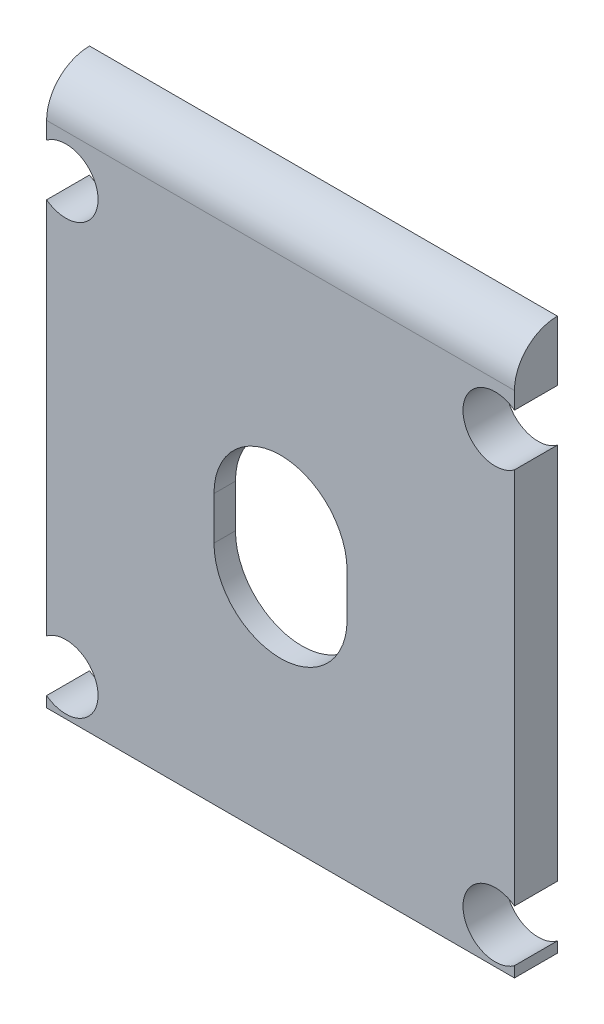
ISO-10303-21;
HEADER;
FILE_DESCRIPTION(('STEP AP214'),'2;1');
FILE_NAME('part.step','',(''),(''),'','','');
FILE_SCHEMA(('AUTOMOTIVE_DESIGN { 1 0 10303 214 1 1 1 1 }'));
ENDSEC;
DATA;
#1=APPLICATION_CONTEXT('core data for automotive mechanical design processes');
#2=APPLICATION_PROTOCOL_DEFINITION('international standard','automotive_design',2000,#1);
#3=PRODUCT_CONTEXT('',#1,'mechanical');
#4=PRODUCT('Part','Part','',(#3));
#5=PRODUCT_RELATED_PRODUCT_CATEGORY('part','',(#4));
#6=PRODUCT_DEFINITION_FORMATION('','',#4);
#7=PRODUCT_DEFINITION_CONTEXT('part definition',#1,'design');
#8=PRODUCT_DEFINITION('design','',#6,#7);
#9=PRODUCT_DEFINITION_SHAPE('','',#8);
#10=(LENGTH_UNIT() NAMED_UNIT(*) SI_UNIT(.MILLI.,.METRE.));
#11=(NAMED_UNIT(*) PLANE_ANGLE_UNIT() SI_UNIT($,.RADIAN.));
#12=(NAMED_UNIT(*) SI_UNIT($,.STERADIAN.) SOLID_ANGLE_UNIT());
#13=UNCERTAINTY_MEASURE_WITH_UNIT(LENGTH_MEASURE(1.E-05),#10,'distance_accuracy_value','');
#14=(GEOMETRIC_REPRESENTATION_CONTEXT(3) GLOBAL_UNCERTAINTY_ASSIGNED_CONTEXT((#13)) GLOBAL_UNIT_ASSIGNED_CONTEXT((#10,
#11,#12)) REPRESENTATION_CONTEXT('',''));
#15=CARTESIAN_POINT('',(0.,0.,0.));
#16=DIRECTION('',(0.,0.,1.));
#17=DIRECTION('',(1.,0.,0.));
#18=AXIS2_PLACEMENT_3D('',#15,#16,#17);
#19=CARTESIAN_POINT('',(50.,148.579145763423,51.9762421943497));
#20=DIRECTION('',(0.,0.,-1.));
#21=DIRECTION('',(-1.,0.,0.));
#22=AXIS2_PLACEMENT_3D('',#19,#20,#21);
#23=PLANE('',#22);
#24=DIRECTION('',(0.,-1.,0.));
#25=VECTOR('',#24,1.);
#26=CARTESIAN_POINT('',(45.1,198.42316898878,51.9762421943497));
#27=LINE('',#26,#25);
#28=CARTESIAN_POINT('',(45.1,200.42316898878,51.9762421943497));
#29=VERTEX_POINT('',#28);
#30=CARTESIAN_POINT('',(45.1,198.42316898878,51.9762421943497));
#31=VERTEX_POINT('',#30);
#32=EDGE_CURVE('E167',#29,#31,#27,.T.);
#33=ORIENTED_EDGE('',*,*,#32,.T.);
#34=CARTESIAN_POINT('',(42.,198.42316898878,51.9762421943497));
#35=DIRECTION('',(0.,0.,-1.));
#36=DIRECTION('',(-1.,0.,0.));
#37=AXIS2_PLACEMENT_3D('',#34,#35,#36);
#38=CIRCLE('',#37,3.1);
#39=CARTESIAN_POINT('',(38.9,198.42316898878,51.9762421943497));
#40=VERTEX_POINT('',#39);
#41=EDGE_CURVE('E158',#31,#40,#38,.T.);
#42=ORIENTED_EDGE('',*,*,#41,.T.);
#43=DIRECTION('',(0.,1.,0.));
#44=VECTOR('',#43,1.);
#45=CARTESIAN_POINT('',(38.9,198.42316898878,51.9762421943497));
#46=LINE('',#45,#44);
#47=CARTESIAN_POINT('',(38.9,200.42316898878,51.9762421943497));
#48=VERTEX_POINT('',#47);
#49=EDGE_CURVE('E170',#40,#48,#46,.T.);
#50=ORIENTED_EDGE('',*,*,#49,.T.);
#51=CARTESIAN_POINT('',(42.,200.42316898878,51.9762421943497));
#52=DIRECTION('',(0.,0.,-1.));
#53=DIRECTION('',(-1.,0.,0.));
#54=AXIS2_PLACEMENT_3D('',#51,#52,#53);
#55=CIRCLE('',#54,3.1);
#56=EDGE_CURVE('E63',#48,#29,#55,.T.);
#57=ORIENTED_EDGE('',*,*,#56,.T.);
#58=EDGE_LOOP('',(#33,#42,#50,#57));
#59=FACE_BOUND('',#58,.T.);
#60=DIRECTION('',(0.,1.,0.));
#61=VECTOR('',#60,1.);
#62=CARTESIAN_POINT('',(52.8963023340713,187.879145763423,51.9762421943497));
#63=LINE('',#62,#61);
#64=CARTESIAN_POINT('',(52.8963023340713,210.781910131842,51.9762421943497));
#65=VERTEX_POINT('',#64);
#66=CARTESIAN_POINT('',(52.8963023340713,211.579145763423,51.9762421943497));
#67=VERTEX_POINT('',#66);
#68=EDGE_CURVE('E249',#65,#67,#63,.T.);
#69=ORIENTED_EDGE('',*,*,#68,.T.);
#70=DIRECTION('',(-1.,0.,0.));
#71=VECTOR('',#70,1.);
#72=CARTESIAN_POINT('',(50.,211.579145763423,51.9762421943497));
#73=LINE('',#72,#71);
#74=CARTESIAN_POINT('',(31.1036976659287,211.579145763423,51.9762421943497));
#75=VERTEX_POINT('',#74);
#76=EDGE_CURVE('E318',#67,#75,#73,.T.);
#77=ORIENTED_EDGE('',*,*,#76,.T.);
#78=DIRECTION('',(0.,1.,0.));
#79=VECTOR('',#78,1.);
#80=CARTESIAN_POINT('',(31.1036976659287,187.879145763423,51.9762421943497));
#81=LINE('',#80,#79);
#82=CARTESIAN_POINT('',(31.1036976659287,210.781910131842,51.9762421943497));
#83=VERTEX_POINT('',#82);
#84=EDGE_CURVE('E228',#83,#75,#81,.T.);
#85=ORIENTED_EDGE('',*,*,#84,.F.);
#86=CARTESIAN_POINT('',(32.,209.579145763423,51.9762421943497));
#87=DIRECTION('',(0.,0.,1.));
#88=DIRECTION('',(1.,0.,0.));
#89=AXIS2_PLACEMENT_3D('',#86,#87,#88);
#90=CIRCLE('',#89,1.5);
#91=CARTESIAN_POINT('',(31.1036976659287,208.376381395004,51.9762421943497));
#92=VERTEX_POINT('',#91);
#93=EDGE_CURVE('E236',#92,#83,#90,.T.);
#94=ORIENTED_EDGE('',*,*,#93,.F.);
#95=CARTESIAN_POINT('',(31.1036976659287,190.781910131842,51.9762421943497));
#96=VERTEX_POINT('',#95);
#97=EDGE_CURVE('E254',#96,#92,#81,.T.);
#98=ORIENTED_EDGE('',*,*,#97,.F.);
#99=CARTESIAN_POINT('',(32.,189.579145763423,51.9762421943497));
#100=DIRECTION('',(0.,0.,1.));
#101=DIRECTION('',(1.,0.,0.));
#102=AXIS2_PLACEMENT_3D('',#99,#100,#101);
#103=CIRCLE('',#102,1.5);
#104=CARTESIAN_POINT('',(31.1036976659287,188.376381395004,51.9762421943497));
#105=VERTEX_POINT('',#104);
#106=EDGE_CURVE('E262',#105,#96,#103,.T.);
#107=ORIENTED_EDGE('',*,*,#106,.F.);
#108=CARTESIAN_POINT('',(31.1036976659287,187.879145763423,51.9762421943497));
#109=VERTEX_POINT('',#108);
#110=EDGE_CURVE('E250',#109,#105,#81,.T.);
#111=ORIENTED_EDGE('',*,*,#110,.F.);
#112=DIRECTION('',(1.,0.,0.));
#113=VECTOR('',#112,1.);
#114=CARTESIAN_POINT('',(31.1036976659287,187.879145763423,51.9762421943497));
#115=LINE('',#114,#113);
#116=CARTESIAN_POINT('',(52.8963023340713,187.879145763423,51.9762421943497));
#117=VERTEX_POINT('',#116);
#118=EDGE_CURVE('E216',#109,#117,#115,.T.);
#119=ORIENTED_EDGE('',*,*,#118,.T.);
#120=CARTESIAN_POINT('',(52.8963023340713,188.376381395004,51.9762421943497));
#121=VERTEX_POINT('',#120);
#122=EDGE_CURVE('E245',#117,#121,#63,.T.);
#123=ORIENTED_EDGE('',*,*,#122,.T.);
#124=CARTESIAN_POINT('',(52.,189.579145763423,51.9762421943497));
#125=DIRECTION('',(0.,0.,1.));
#126=DIRECTION('',(1.,0.,0.));
#127=AXIS2_PLACEMENT_3D('',#124,#125,#126);
#128=CIRCLE('',#127,1.5);
#129=CARTESIAN_POINT('',(52.8963023340713,190.781910131842,51.9762421943497));
#130=VERTEX_POINT('',#129);
#131=EDGE_CURVE('E294',#130,#121,#128,.T.);
#132=ORIENTED_EDGE('',*,*,#131,.F.);
#133=CARTESIAN_POINT('',(52.8963023340713,208.376381395004,51.9762421943497));
#134=VERTEX_POINT('',#133);
#135=EDGE_CURVE('E248',#130,#134,#63,.T.);
#136=ORIENTED_EDGE('',*,*,#135,.T.);
#137=CARTESIAN_POINT('',(52.,209.579145763423,51.9762421943497));
#138=DIRECTION('',(0.,0.,1.));
#139=DIRECTION('',(1.,0.,0.));
#140=AXIS2_PLACEMENT_3D('',#137,#138,#139);
#141=CIRCLE('',#140,1.5);
#142=EDGE_CURVE('E258',#65,#134,#141,.T.);
#143=ORIENTED_EDGE('',*,*,#142,.F.);
#144=EDGE_LOOP('',(#69,#77,#85,#94,#98,#107,#111,#119,#123,#132,#136,#143));
#145=FACE_BOUND('',#144,.T.);
#146=ADVANCED_FACE('F42',(#59,#145),#23,.F.);
#147=CARTESIAN_POINT('',(31.1036976659287,187.879145763423,49.9762421943497));
#148=DIRECTION('',(-1.,0.,0.));
#149=DIRECTION('',(0.,0.,1.));
#150=AXIS2_PLACEMENT_3D('',#147,#148,#149);
#151=PLANE('',#150);
#152=ORIENTED_EDGE('',*,*,#97,.T.);
#153=DIRECTION('',(0.,0.,-1.));
#154=VECTOR('',#153,1.);
#155=CARTESIAN_POINT('',(31.1036976659287,208.376381395004,384.));
#156=LINE('',#155,#154);
#157=CARTESIAN_POINT('',(31.1036976659287,208.376381395004,49.9762421943497));
#158=VERTEX_POINT('',#157);
#159=EDGE_CURVE('E310',#158,#92,#156,.F.);
#160=ORIENTED_EDGE('',*,*,#159,.F.);
#161=DIRECTION('',(0.,1.,0.));
#162=VECTOR('',#161,1.);
#163=CARTESIAN_POINT('',(31.1036976659287,187.879145763423,49.9762421943497));
#164=LINE('',#163,#162);
#165=CARTESIAN_POINT('',(31.1036976659287,190.781910131842,49.9762421943497));
#166=VERTEX_POINT('',#165);
#167=EDGE_CURVE('E237',#166,#158,#164,.T.);
#168=ORIENTED_EDGE('',*,*,#167,.F.);
#169=DIRECTION('',(0.,0.,-1.));
#170=VECTOR('',#169,1.);
#171=CARTESIAN_POINT('',(31.1036976659287,190.781910131842,384.));
#172=LINE('',#171,#170);
#173=EDGE_CURVE('E290',#96,#166,#172,.T.);
#174=ORIENTED_EDGE('',*,*,#173,.F.);
#175=EDGE_LOOP('',(#152,#160,#168,#174));
#176=FACE_BOUND('',#175,.T.);
#177=ADVANCED_FACE('F360',(#176),#151,.T.);
#178=ORIENTED_EDGE('',*,*,#84,.T.);
#179=CARTESIAN_POINT('',(31.1036976659287,211.579145763423,49.9762421943497));
#180=DIRECTION('',(-1.,0.,0.));
#181=DIRECTION('',(0.,0.,1.));
#182=AXIS2_PLACEMENT_3D('',#179,#180,#181);
#183=CIRCLE('',#182,2.);
#184=CARTESIAN_POINT('',(31.1036976659287,213.579145763423,49.9762421943497));
#185=VERTEX_POINT('',#184);
#186=EDGE_CURVE('E51',#75,#185,#183,.T.);
#187=ORIENTED_EDGE('',*,*,#186,.T.);
#188=CARTESIAN_POINT('',(31.1036976659287,210.781910131842,49.9762421943497));
#189=VERTEX_POINT('',#188);
#190=EDGE_CURVE('E238',#189,#185,#164,.T.);
#191=ORIENTED_EDGE('',*,*,#190,.F.);
#192=DIRECTION('',(0.,0.,-1.));
#193=VECTOR('',#192,1.);
#194=CARTESIAN_POINT('',(31.1036976659287,210.781910131842,384.));
#195=LINE('',#194,#193);
#196=EDGE_CURVE('E314',#83,#189,#195,.T.);
#197=ORIENTED_EDGE('',*,*,#196,.F.);
#198=EDGE_LOOP('',(#178,#187,#191,#197));
#199=FACE_BOUND('',#198,.T.);
#200=ADVANCED_FACE('F326',(#199),#151,.T.);
#201=CARTESIAN_POINT('',(52.8963023340713,187.879145763423,49.9762421943497));
#202=DIRECTION('',(1.,0.,0.));
#203=DIRECTION('',(0.,0.,-1.));
#204=AXIS2_PLACEMENT_3D('',#201,#202,#203);
#205=PLANE('',#204);
#206=ORIENTED_EDGE('',*,*,#135,.F.);
#207=DIRECTION('',(0.,0.,-1.));
#208=VECTOR('',#207,1.);
#209=CARTESIAN_POINT('',(52.8963023340713,190.781910131842,384.));
#210=LINE('',#209,#208);
#211=CARTESIAN_POINT('',(52.8963023340713,190.781910131842,49.9762421943497));
#212=VERTEX_POINT('',#211);
#213=EDGE_CURVE('E298',#212,#130,#210,.F.);
#214=ORIENTED_EDGE('',*,*,#213,.F.);
#215=DIRECTION('',(0.,1.,0.));
#216=VECTOR('',#215,1.);
#217=CARTESIAN_POINT('',(52.8963023340713,187.879145763423,49.9762421943497));
#218=LINE('',#217,#216);
#219=CARTESIAN_POINT('',(52.8963023340713,208.376381395004,49.9762421943497));
#220=VERTEX_POINT('',#219);
#221=EDGE_CURVE('E243',#212,#220,#218,.T.);
#222=ORIENTED_EDGE('',*,*,#221,.T.);
#223=DIRECTION('',(0.,0.,-1.));
#224=VECTOR('',#223,1.);
#225=CARTESIAN_POINT('',(52.8963023340713,208.376381395004,384.));
#226=LINE('',#225,#224);
#227=EDGE_CURVE('E270',#134,#220,#226,.T.);
#228=ORIENTED_EDGE('',*,*,#227,.F.);
#229=EDGE_LOOP('',(#206,#214,#222,#228));
#230=FACE_BOUND('',#229,.T.);
#231=ADVANCED_FACE('F347',(#230),#205,.T.);
#232=ORIENTED_EDGE('',*,*,#122,.F.);
#233=DIRECTION('',(0.,0.,-1.));
#234=VECTOR('',#233,1.);
#235=CARTESIAN_POINT('',(52.8963023340713,187.879145763423,49.9762421943497));
#236=LINE('',#235,#234);
#237=CARTESIAN_POINT('',(52.8963023340713,187.879145763423,49.9762421943497));
#238=VERTEX_POINT('',#237);
#239=EDGE_CURVE('E220',#117,#238,#236,.T.);
#240=ORIENTED_EDGE('',*,*,#239,.T.);
#241=CARTESIAN_POINT('',(52.8963023340713,188.376381395004,49.9762421943497));
#242=VERTEX_POINT('',#241);
#243=EDGE_CURVE('E239',#238,#242,#218,.T.);
#244=ORIENTED_EDGE('',*,*,#243,.T.);
#245=DIRECTION('',(0.,0.,-1.));
#246=VECTOR('',#245,1.);
#247=CARTESIAN_POINT('',(52.8963023340713,188.376381395004,384.));
#248=LINE('',#247,#246);
#249=EDGE_CURVE('E302',#121,#242,#248,.T.);
#250=ORIENTED_EDGE('',*,*,#249,.F.);
#251=EDGE_LOOP('',(#232,#240,#244,#250));
#252=FACE_BOUND('',#251,.T.);
#253=ADVANCED_FACE('F375',(#252),#205,.T.);
#254=CARTESIAN_POINT('',(31.1036976659287,187.879145763423,49.9762421943497));
#255=VERTEX_POINT('',#254);
#256=CARTESIAN_POINT('',(31.1036976659287,188.376381395004,49.9762421943497));
#257=VERTEX_POINT('',#256);
#258=EDGE_CURVE('E232',#255,#257,#164,.T.);
#259=ORIENTED_EDGE('',*,*,#258,.F.);
#260=DIRECTION('',(0.,0.,1.));
#261=VECTOR('',#260,1.);
#262=CARTESIAN_POINT('',(31.1036976659287,187.879145763423,49.9762421943497));
#263=LINE('',#262,#261);
#264=EDGE_CURVE('E212',#255,#109,#263,.T.);
#265=ORIENTED_EDGE('',*,*,#264,.T.);
#266=ORIENTED_EDGE('',*,*,#110,.T.);
#267=DIRECTION('',(0.,0.,-1.));
#268=VECTOR('',#267,1.);
#269=CARTESIAN_POINT('',(31.1036976659287,188.376381395004,384.));
#270=LINE('',#269,#268);
#271=EDGE_CURVE('E286',#257,#105,#270,.F.);
#272=ORIENTED_EDGE('',*,*,#271,.F.);
#273=EDGE_LOOP('',(#259,#265,#266,#272));
#274=FACE_BOUND('',#273,.T.);
#275=ADVANCED_FACE('F368',(#274),#151,.T.);
#276=CARTESIAN_POINT('',(31.1036976659287,187.879145763423,49.9762421943497));
#277=DIRECTION('',(0.,0.,-1.));
#278=DIRECTION('',(-1.,0.,0.));
#279=AXIS2_PLACEMENT_3D('',#276,#277,#278);
#280=PLANE('',#279);
#281=CARTESIAN_POINT('',(42.,199.42316898878,49.9762421943497));
#282=DIRECTION('',(0.,0.,-1.));
#283=DIRECTION('',(-1.,0.,0.));
#284=AXIS2_PLACEMENT_3D('',#281,#282,#283);
#285=CIRCLE('',#284,7.34999999999999);
#286=CARTESIAN_POINT('',(34.65,199.42316898878,49.9762421943497));
#287=VERTEX_POINT('',#286);
#288=EDGE_CURVE('E198',#287,#287,#285,.T.);
#289=ORIENTED_EDGE('',*,*,#288,.F.);
#290=EDGE_LOOP('',(#289));
#291=FACE_BOUND('',#290,.T.);
#292=ORIENTED_EDGE('',*,*,#167,.T.);
#293=CARTESIAN_POINT('',(32.,209.579145763423,49.9762421943497));
#294=DIRECTION('',(0.,0.,-1.));
#295=DIRECTION('',(-1.,0.,0.));
#296=AXIS2_PLACEMENT_3D('',#293,#294,#295);
#297=CIRCLE('',#296,1.5);
#298=EDGE_CURVE('E274',#189,#158,#297,.T.);
#299=ORIENTED_EDGE('',*,*,#298,.F.);
#300=ORIENTED_EDGE('',*,*,#190,.T.);
#301=DIRECTION('',(-1.,0.,0.));
#302=VECTOR('',#301,1.);
#303=CARTESIAN_POINT('',(31.1036976659287,213.579145763423,49.9762421943497));
#304=LINE('',#303,#302);
#305=CARTESIAN_POINT('',(52.8963023340713,213.579145763423,49.9762421943497));
#306=VERTEX_POINT('',#305);
#307=EDGE_CURVE('E208',#306,#185,#304,.T.);
#308=ORIENTED_EDGE('',*,*,#307,.F.);
#309=CARTESIAN_POINT('',(52.8963023340713,210.781910131842,49.9762421943497));
#310=VERTEX_POINT('',#309);
#311=EDGE_CURVE('E244',#310,#306,#218,.T.);
#312=ORIENTED_EDGE('',*,*,#311,.F.);
#313=CARTESIAN_POINT('',(52.,209.579145763423,49.9762421943497));
#314=DIRECTION('',(0.,0.,-1.));
#315=DIRECTION('',(-1.,0.,0.));
#316=AXIS2_PLACEMENT_3D('',#313,#314,#315);
#317=CIRCLE('',#316,1.5);
#318=EDGE_CURVE('E278',#220,#310,#317,.T.);
#319=ORIENTED_EDGE('',*,*,#318,.F.);
#320=ORIENTED_EDGE('',*,*,#221,.F.);
#321=CARTESIAN_POINT('',(52.,189.579145763423,49.9762421943497));
#322=DIRECTION('',(0.,0.,-1.));
#323=DIRECTION('',(-1.,0.,0.));
#324=AXIS2_PLACEMENT_3D('',#321,#322,#323);
#325=CIRCLE('',#324,1.5);
#326=EDGE_CURVE('E306',#242,#212,#325,.T.);
#327=ORIENTED_EDGE('',*,*,#326,.F.);
#328=ORIENTED_EDGE('',*,*,#243,.F.);
#329=DIRECTION('',(-1.,0.,0.));
#330=VECTOR('',#329,1.);
#331=CARTESIAN_POINT('',(31.1036976659287,187.879145763423,49.9762421943497));
#332=LINE('',#331,#330);
#333=EDGE_CURVE('E224',#238,#255,#332,.T.);
#334=ORIENTED_EDGE('',*,*,#333,.T.);
#335=ORIENTED_EDGE('',*,*,#258,.T.);
#336=CARTESIAN_POINT('',(32.,189.579145763423,49.9762421943497));
#337=DIRECTION('',(0.,0.,-1.));
#338=DIRECTION('',(-1.,0.,0.));
#339=AXIS2_PLACEMENT_3D('',#336,#337,#338);
#340=CIRCLE('',#339,1.5);
#341=EDGE_CURVE('E282',#166,#257,#340,.T.);
#342=ORIENTED_EDGE('',*,*,#341,.F.);
#343=EDGE_LOOP('',(#292,#299,#300,#308,#312,#319,#320,#327,#328,#334,#335,#342));
#344=FACE_BOUND('',#343,.T.);
#345=ADVANCED_FACE('F333',(#291,#344),#280,.T.);
#346=ORIENTED_EDGE('',*,*,#311,.T.);
#347=CARTESIAN_POINT('',(52.8963023340713,211.579145763423,49.9762421943497));
#348=DIRECTION('',(1.,0.,0.));
#349=DIRECTION('',(0.,0.,-1.));
#350=AXIS2_PLACEMENT_3D('',#347,#348,#349);
#351=CIRCLE('',#350,2.);
#352=EDGE_CURVE('E12',#306,#67,#351,.T.);
#353=ORIENTED_EDGE('',*,*,#352,.T.);
#354=ORIENTED_EDGE('',*,*,#68,.F.);
#355=DIRECTION('',(0.,0.,-1.));
#356=VECTOR('',#355,1.);
#357=CARTESIAN_POINT('',(52.8963023340713,210.781910131842,384.));
#358=LINE('',#357,#356);
#359=EDGE_CURVE('E266',#310,#65,#358,.F.);
#360=ORIENTED_EDGE('',*,*,#359,.F.);
#361=EDGE_LOOP('',(#346,#353,#354,#360));
#362=FACE_BOUND('',#361,.T.);
#363=ADVANCED_FACE('F340',(#362),#205,.T.);
#364=CARTESIAN_POINT('',(32.,209.579145763423,384.));
#365=DIRECTION('',(0.,0.,-1.));
#366=DIRECTION('',(-1.,0.,0.));
#367=AXIS2_PLACEMENT_3D('',#364,#365,#366);
#368=CYLINDRICAL_SURFACE('',#367,1.5);
#369=ORIENTED_EDGE('',*,*,#196,.T.);
#370=ORIENTED_EDGE('',*,*,#298,.T.);
#371=ORIENTED_EDGE('',*,*,#159,.T.);
#372=ORIENTED_EDGE('',*,*,#93,.T.);
#373=EDGE_LOOP('',(#369,#370,#371,#372));
#374=FACE_BOUND('',#373,.T.);
#375=ADVANCED_FACE('F358',(#374),#368,.F.);
#376=CARTESIAN_POINT('',(52.,209.579145763423,384.));
#377=DIRECTION('',(0.,0.,-1.));
#378=DIRECTION('',(-1.,0.,0.));
#379=AXIS2_PLACEMENT_3D('',#376,#377,#378);
#380=CYLINDRICAL_SURFACE('',#379,1.5);
#381=ORIENTED_EDGE('',*,*,#227,.T.);
#382=ORIENTED_EDGE('',*,*,#318,.T.);
#383=ORIENTED_EDGE('',*,*,#359,.T.);
#384=ORIENTED_EDGE('',*,*,#142,.T.);
#385=EDGE_LOOP('',(#381,#382,#383,#384));
#386=FACE_BOUND('',#385,.T.);
#387=ADVANCED_FACE('F350',(#386),#380,.F.);
#388=CARTESIAN_POINT('',(32.,189.579145763423,384.));
#389=DIRECTION('',(0.,0.,-1.));
#390=DIRECTION('',(-1.,0.,0.));
#391=AXIS2_PLACEMENT_3D('',#388,#389,#390);
#392=CYLINDRICAL_SURFACE('',#391,1.5);
#393=ORIENTED_EDGE('',*,*,#173,.T.);
#394=ORIENTED_EDGE('',*,*,#341,.T.);
#395=ORIENTED_EDGE('',*,*,#271,.T.);
#396=ORIENTED_EDGE('',*,*,#106,.T.);
#397=EDGE_LOOP('',(#393,#394,#395,#396));
#398=FACE_BOUND('',#397,.T.);
#399=ADVANCED_FACE('F364',(#398),#392,.F.);
#400=CARTESIAN_POINT('',(52.,189.579145763423,384.));
#401=DIRECTION('',(0.,0.,-1.));
#402=DIRECTION('',(-1.,0.,0.));
#403=AXIS2_PLACEMENT_3D('',#400,#401,#402);
#404=CYLINDRICAL_SURFACE('',#403,1.5);
#405=ORIENTED_EDGE('',*,*,#249,.T.);
#406=ORIENTED_EDGE('',*,*,#326,.T.);
#407=ORIENTED_EDGE('',*,*,#213,.T.);
#408=ORIENTED_EDGE('',*,*,#131,.T.);
#409=EDGE_LOOP('',(#405,#406,#407,#408));
#410=FACE_BOUND('',#409,.T.);
#411=ADVANCED_FACE('F377',(#410),#404,.F.);
#412=CARTESIAN_POINT('',(56.,187.879145763423,122.));
#413=DIRECTION('',(0.,1.,0.));
#414=DIRECTION('',(0.,0.,1.));
#415=AXIS2_PLACEMENT_3D('',#412,#413,#414);
#416=PLANE('',#415);
#417=ORIENTED_EDGE('',*,*,#264,.F.);
#418=ORIENTED_EDGE('',*,*,#333,.F.);
#419=ORIENTED_EDGE('',*,*,#239,.F.);
#420=ORIENTED_EDGE('',*,*,#118,.F.);
#421=EDGE_LOOP('',(#417,#418,#419,#420));
#422=FACE_BOUND('',#421,.T.);
#423=ADVANCED_FACE('F370',(#422),#416,.F.);
#424=CARTESIAN_POINT('',(50.,211.579145763423,49.9762421943497));
#425=DIRECTION('',(-1.,0.,0.));
#426=DIRECTION('',(0.,0.,1.));
#427=AXIS2_PLACEMENT_3D('',#424,#425,#426);
#428=CYLINDRICAL_SURFACE('',#427,2.);
#429=ORIENTED_EDGE('',*,*,#352,.F.);
#430=ORIENTED_EDGE('',*,*,#307,.T.);
#431=ORIENTED_EDGE('',*,*,#186,.F.);
#432=ORIENTED_EDGE('',*,*,#76,.F.);
#433=EDGE_LOOP('',(#429,#430,#431,#432));
#434=FACE_BOUND('',#433,.T.);
#435=ADVANCED_FACE('F44',(#434),#428,.T.);
#436=CARTESIAN_POINT('',(42.,199.42316898878,50.9762421943497));
#437=DIRECTION('',(0.,0.,-1.));
#438=DIRECTION('',(-1.,0.,0.));
#439=AXIS2_PLACEMENT_3D('',#436,#437,#438);
#440=CYLINDRICAL_SURFACE('',#439,7.34999999999999);
#441=CARTESIAN_POINT('',(42.,199.42316898878,50.9762421943497));
#442=DIRECTION('',(0.,0.,-1.));
#443=DIRECTION('',(-1.,0.,0.));
#444=AXIS2_PLACEMENT_3D('',#441,#442,#443);
#445=CIRCLE('',#444,7.34999999999999);
#446=CARTESIAN_POINT('',(34.65,199.42316898878,50.9762421943497));
#447=VERTEX_POINT('',#446);
#448=EDGE_CURVE('E204',#447,#447,#445,.T.);
#449=ORIENTED_EDGE('',*,*,#448,.F.);
#450=EDGE_LOOP('',(#449));
#451=FACE_BOUND('',#450,.T.);
#452=ORIENTED_EDGE('',*,*,#288,.T.);
#453=EDGE_LOOP('',(#452));
#454=FACE_BOUND('',#453,.T.);
#455=ADVANCED_FACE('F469',(#451,#454),#440,.F.);
#456=CARTESIAN_POINT('',(42.,199.42316898878,50.9762421943497));
#457=DIRECTION('',(0.,0.,-1.));
#458=DIRECTION('',(-1.,0.,0.));
#459=AXIS2_PLACEMENT_3D('',#456,#457,#458);
#460=PLANE('',#459);
#461=CARTESIAN_POINT('',(42.,198.42316898878,50.9762421943497));
#462=DIRECTION('',(0.,0.,-1.));
#463=DIRECTION('',(-1.,0.,0.));
#464=AXIS2_PLACEMENT_3D('',#461,#462,#463);
#465=CIRCLE('',#464,3.1);
#466=CARTESIAN_POINT('',(45.1,198.42316898878,50.9762421943497));
#467=VERTEX_POINT('',#466);
#468=CARTESIAN_POINT('',(38.9,198.42316898878,50.9762421943497));
#469=VERTEX_POINT('',#468);
#470=EDGE_CURVE('E161',#467,#469,#465,.T.);
#471=ORIENTED_EDGE('',*,*,#470,.F.);
#472=DIRECTION('',(0.,-1.,0.));
#473=VECTOR('',#472,1.);
#474=CARTESIAN_POINT('',(45.1,198.42316898878,50.9762421943497));
#475=LINE('',#474,#473);
#476=CARTESIAN_POINT('',(45.1,200.42316898878,50.9762421943497));
#477=VERTEX_POINT('',#476);
#478=EDGE_CURVE('E178',#477,#467,#475,.T.);
#479=ORIENTED_EDGE('',*,*,#478,.F.);
#480=CARTESIAN_POINT('',(42.,200.42316898878,50.9762421943497));
#481=DIRECTION('',(0.,0.,-1.));
#482=DIRECTION('',(-1.,0.,0.));
#483=AXIS2_PLACEMENT_3D('',#480,#481,#482);
#484=CIRCLE('',#483,3.1);
#485=CARTESIAN_POINT('',(38.9,200.42316898878,50.9762421943497));
#486=VERTEX_POINT('',#485);
#487=EDGE_CURVE('E58',#486,#477,#484,.T.);
#488=ORIENTED_EDGE('',*,*,#487,.F.);
#489=DIRECTION('',(0.,1.,0.));
#490=VECTOR('',#489,1.);
#491=CARTESIAN_POINT('',(38.9,198.42316898878,50.9762421943497));
#492=LINE('',#491,#490);
#493=EDGE_CURVE('E190',#469,#486,#492,.T.);
#494=ORIENTED_EDGE('',*,*,#493,.F.);
#495=EDGE_LOOP('',(#471,#479,#488,#494));
#496=FACE_BOUND('',#495,.T.);
#497=ORIENTED_EDGE('',*,*,#448,.T.);
#498=EDGE_LOOP('',(#497));
#499=FACE_BOUND('',#498,.T.);
#500=ADVANCED_FACE('F475',(#496,#499),#460,.T.);
#501=CARTESIAN_POINT('',(42.,198.42316898878,51.9762421943497));
#502=DIRECTION('',(0.,0.,-1.));
#503=DIRECTION('',(-1.,0.,0.));
#504=AXIS2_PLACEMENT_3D('',#501,#502,#503);
#505=CYLINDRICAL_SURFACE('',#504,3.1);
#506=ORIENTED_EDGE('',*,*,#470,.T.);
#507=DIRECTION('',(0.,0.,-1.));
#508=VECTOR('',#507,1.);
#509=CARTESIAN_POINT('',(38.9,198.42316898878,51.9762421943497));
#510=LINE('',#509,#508);
#511=EDGE_CURVE('E154',#40,#469,#510,.T.);
#512=ORIENTED_EDGE('',*,*,#511,.F.);
#513=ORIENTED_EDGE('',*,*,#41,.F.);
#514=DIRECTION('',(0.,0.,-1.));
#515=VECTOR('',#514,1.);
#516=CARTESIAN_POINT('',(45.1,198.42316898878,51.9762421943497));
#517=LINE('',#516,#515);
#518=EDGE_CURVE('E195',#31,#467,#517,.T.);
#519=ORIENTED_EDGE('',*,*,#518,.T.);
#520=EDGE_LOOP('',(#506,#512,#513,#519));
#521=FACE_BOUND('',#520,.T.);
#522=ADVANCED_FACE('F156',(#521),#505,.F.);
#523=CARTESIAN_POINT('',(45.1,198.42316898878,51.9762421943497));
#524=DIRECTION('',(1.,0.,0.));
#525=DIRECTION('',(0.,0.,-1.));
#526=AXIS2_PLACEMENT_3D('',#523,#524,#525);
#527=PLANE('',#526);
#528=ORIENTED_EDGE('',*,*,#478,.T.);
#529=ORIENTED_EDGE('',*,*,#518,.F.);
#530=ORIENTED_EDGE('',*,*,#32,.F.);
#531=DIRECTION('',(0.,0.,-1.));
#532=VECTOR('',#531,1.);
#533=CARTESIAN_POINT('',(45.1,200.42316898878,51.9762421943497));
#534=LINE('',#533,#532);
#535=EDGE_CURVE('E199',#29,#477,#534,.T.);
#536=ORIENTED_EDGE('',*,*,#535,.T.);
#537=EDGE_LOOP('',(#528,#529,#530,#536));
#538=FACE_BOUND('',#537,.T.);
#539=ADVANCED_FACE('F490',(#538),#527,.F.);
#540=CARTESIAN_POINT('',(42.,200.42316898878,51.9762421943497));
#541=DIRECTION('',(0.,0.,-1.));
#542=DIRECTION('',(-1.,0.,0.));
#543=AXIS2_PLACEMENT_3D('',#540,#541,#542);
#544=CYLINDRICAL_SURFACE('',#543,3.1);
#545=ORIENTED_EDGE('',*,*,#487,.T.);
#546=ORIENTED_EDGE('',*,*,#535,.F.);
#547=ORIENTED_EDGE('',*,*,#56,.F.);
#548=DIRECTION('',(0.,0.,-1.));
#549=VECTOR('',#548,1.);
#550=CARTESIAN_POINT('',(38.9,200.42316898878,51.9762421943497));
#551=LINE('',#550,#549);
#552=EDGE_CURVE('E166',#48,#486,#551,.T.);
#553=ORIENTED_EDGE('',*,*,#552,.T.);
#554=EDGE_LOOP('',(#545,#546,#547,#553));
#555=FACE_BOUND('',#554,.T.);
#556=ADVANCED_FACE('F497',(#555),#544,.F.);
#557=CARTESIAN_POINT('',(38.9,198.42316898878,51.9762421943497));
#558=DIRECTION('',(-1.,0.,0.));
#559=DIRECTION('',(0.,0.,1.));
#560=AXIS2_PLACEMENT_3D('',#557,#558,#559);
#561=PLANE('',#560);
#562=ORIENTED_EDGE('',*,*,#493,.T.);
#563=ORIENTED_EDGE('',*,*,#552,.F.);
#564=ORIENTED_EDGE('',*,*,#49,.F.);
#565=ORIENTED_EDGE('',*,*,#511,.T.);
#566=EDGE_LOOP('',(#562,#563,#564,#565));
#567=FACE_BOUND('',#566,.T.);
#568=ADVANCED_FACE('F171',(#567),#561,.F.);
#569=CLOSED_SHELL('',(#146,#177,#200,#231,#253,#275,#345,#363,#375,#387,#399,#411,#423,#435,
#455,#500,#522,#539,#556,#568));
#570=MANIFOLD_SOLID_BREP('B2',#569);
#571=ADVANCED_BREP_SHAPE_REPRESENTATION('',(#18,#570),#14);
#572=SHAPE_DEFINITION_REPRESENTATION(#9,#571);
ENDSEC;
END-ISO-10303-21;
